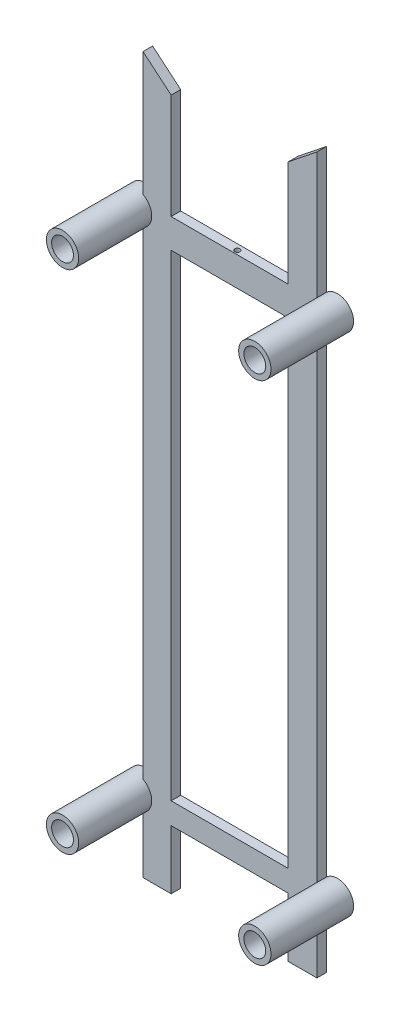
ISO-10303-21;
HEADER;
FILE_DESCRIPTION(('STEP AP214'),'2;1');
FILE_NAME('part.step','',(''),(''),'','','');
FILE_SCHEMA(('AUTOMOTIVE_DESIGN { 1 0 10303 214 1 1 1 1 }'));
ENDSEC;
DATA;
#1=APPLICATION_CONTEXT('core data for automotive mechanical design processes');
#2=APPLICATION_PROTOCOL_DEFINITION('international standard','automotive_design',2000,#1);
#3=PRODUCT_CONTEXT('',#1,'mechanical');
#4=PRODUCT('Part','Part','',(#3));
#5=PRODUCT_RELATED_PRODUCT_CATEGORY('part','',(#4));
#6=PRODUCT_DEFINITION_FORMATION('','',#4);
#7=PRODUCT_DEFINITION_CONTEXT('part definition',#1,'design');
#8=PRODUCT_DEFINITION('design','',#6,#7);
#9=PRODUCT_DEFINITION_SHAPE('','',#8);
#10=(LENGTH_UNIT() NAMED_UNIT(*) SI_UNIT(.MILLI.,.METRE.));
#11=(NAMED_UNIT(*) PLANE_ANGLE_UNIT() SI_UNIT($,.RADIAN.));
#12=(NAMED_UNIT(*) SI_UNIT($,.STERADIAN.) SOLID_ANGLE_UNIT());
#13=UNCERTAINTY_MEASURE_WITH_UNIT(LENGTH_MEASURE(1.E-05),#10,'distance_accuracy_value','');
#14=(GEOMETRIC_REPRESENTATION_CONTEXT(3) GLOBAL_UNCERTAINTY_ASSIGNED_CONTEXT((#13)) GLOBAL_UNIT_ASSIGNED_CONTEXT((#10,
#11,#12)) REPRESENTATION_CONTEXT('',''));
#15=CARTESIAN_POINT('',(0.,0.,0.));
#16=DIRECTION('',(0.,0.,1.));
#17=DIRECTION('',(1.,0.,0.));
#18=AXIS2_PLACEMENT_3D('',#15,#16,#17);
#19=CARTESIAN_POINT('',(518.159541103016,0.,1061.01410856187));
#20=DIRECTION('',(-1.,0.,0.));
#21=DIRECTION('',(0.,0.,1.));
#22=AXIS2_PLACEMENT_3D('',#19,#20,#21);
#23=PLANE('',#22);
#24=DIRECTION('',(0.,1.,0.));
#25=VECTOR('',#24,1.);
#26=CARTESIAN_POINT('',(518.159541103016,0.,1027.01410856187));
#27=LINE('',#26,#25);
#28=CARTESIAN_POINT('',(518.159541103016,-2062.02336684521,1027.01410856187));
#29=VERTEX_POINT('',#28);
#30=CARTESIAN_POINT('',(518.159541103016,-368.039095782691,1027.01410856187));
#31=VERTEX_POINT('',#30);
#32=EDGE_CURVE('E543',#29,#31,#27,.T.);
#33=ORIENTED_EDGE('',*,*,#32,.F.);
#34=DIRECTION('',(0.,0.,-1.));
#35=VECTOR('',#34,1.);
#36=CARTESIAN_POINT('',(518.159541103016,-2062.02336684521,1320.01410856187));
#37=LINE('',#36,#35);
#38=CARTESIAN_POINT('',(518.159541103016,-2062.02336684521,1061.01410856187));
#39=VERTEX_POINT('',#38);
#40=EDGE_CURVE('E415',#29,#39,#37,.F.);
#41=ORIENTED_EDGE('',*,*,#40,.T.);
#42=DIRECTION('',(0.,1.,0.));
#43=VECTOR('',#42,1.);
#44=CARTESIAN_POINT('',(518.159541103016,0.,1061.01410856187));
#45=LINE('',#44,#43);
#46=CARTESIAN_POINT('',(518.159541103016,-368.039095782691,1061.01410856187));
#47=VERTEX_POINT('',#46);
#48=EDGE_CURVE('E368',#39,#47,#45,.T.);
#49=ORIENTED_EDGE('',*,*,#48,.T.);
#50=DIRECTION('',(0.,0.,-1.));
#51=VECTOR('',#50,1.);
#52=CARTESIAN_POINT('',(518.159541103016,-368.039095782691,1320.01410856187));
#53=LINE('',#52,#51);
#54=EDGE_CURVE('E399',#47,#31,#53,.T.);
#55=ORIENTED_EDGE('',*,*,#54,.T.);
#56=EDGE_LOOP('',(#33,#41,#49,#55));
#57=FACE_BOUND('',#56,.T.);
#58=ADVANCED_FACE('F91',(#57),#23,.T.);
#59=CARTESIAN_POINT('',(518.159541103016,-2363.99744422089,1061.01410856187));
#60=VERTEX_POINT('',#59);
#61=CARTESIAN_POINT('',(518.159541103016,-2163.69833162458,1061.01410856187));
#62=VERTEX_POINT('',#61);
#63=EDGE_CURVE('E367',#60,#62,#45,.T.);
#64=ORIENTED_EDGE('',*,*,#63,.T.);
#65=DIRECTION('',(0.,0.,-1.));
#66=VECTOR('',#65,1.);
#67=CARTESIAN_POINT('',(518.159541103016,-2163.69833162458,1320.01410856187));
#68=LINE('',#67,#66);
#69=CARTESIAN_POINT('',(518.159541103016,-2163.69833162458,1027.01410856187));
#70=VERTEX_POINT('',#69);
#71=EDGE_CURVE('E420',#62,#70,#68,.T.);
#72=ORIENTED_EDGE('',*,*,#71,.T.);
#73=CARTESIAN_POINT('',(518.159541103016,-2363.99744422089,1027.01410856187));
#74=VERTEX_POINT('',#73);
#75=EDGE_CURVE('E538',#74,#70,#27,.T.);
#76=ORIENTED_EDGE('',*,*,#75,.F.);
#77=DIRECTION('',(0.,0.,-1.));
#78=VECTOR('',#77,1.);
#79=CARTESIAN_POINT('',(518.159541103016,-2363.99744422089,1061.01410856187));
#80=LINE('',#79,#78);
#81=EDGE_CURVE('E338',#60,#74,#80,.T.);
#82=ORIENTED_EDGE('',*,*,#81,.F.);
#83=EDGE_LOOP('',(#64,#72,#76,#82));
#84=FACE_BOUND('',#83,.T.);
#85=ADVANCED_FACE('F540',(#84),#23,.T.);
#86=CARTESIAN_POINT('',(0.,0.,1061.01410856187));
#87=DIRECTION('',(0.,0.,-1.));
#88=DIRECTION('',(-1.,0.,0.));
#89=AXIS2_PLACEMENT_3D('',#86,#87,#88);
#90=PLANE('',#89);
#91=CARTESIAN_POINT('',(518.159541103016,-2141.26120570312,1061.01410856187));
#92=VERTEX_POINT('',#91);
#93=CARTESIAN_POINT('',(518.159541103016,-2084.46049276666,1061.01410856187));
#94=VERTEX_POINT('',#93);
#95=EDGE_CURVE('E360',#92,#94,#45,.T.);
#96=ORIENTED_EDGE('',*,*,#95,.F.);
#97=CARTESIAN_POINT('',(491.765116757733,-2112.86084923489,1061.01410856187));
#98=DIRECTION('',(0.,0.,-1.));
#99=DIRECTION('',(-1.,0.,0.));
#100=AXIS2_PLACEMENT_3D('',#97,#98,#99);
#101=CIRCLE('',#100,38.771715);
#102=EDGE_CURVE('E99',#92,#94,#101,.F.);
#103=ORIENTED_EDGE('',*,*,#102,.T.);
#104=EDGE_LOOP('',(#96,#103));
#105=FACE_BOUND('',#104,.T.);
#106=ADVANCED_FACE('F359',(#105),#90,.F.);
#107=CARTESIAN_POINT('',(518.159541103016,-266.364131003321,1027.01410856187));
#108=VERTEX_POINT('',#107);
#109=CARTESIAN_POINT('',(518.159541103016,172.765208514383,1027.01410856187));
#110=VERTEX_POINT('',#109);
#111=EDGE_CURVE('E546',#108,#110,#27,.T.);
#112=ORIENTED_EDGE('',*,*,#111,.F.);
#113=DIRECTION('',(0.,0.,-1.));
#114=VECTOR('',#113,1.);
#115=CARTESIAN_POINT('',(518.159541103016,-266.364131003321,1320.01410856187));
#116=LINE('',#115,#114);
#117=CARTESIAN_POINT('',(518.159541103016,-266.364131003321,1061.01410856187));
#118=VERTEX_POINT('',#117);
#119=EDGE_CURVE('E396',#108,#118,#116,.F.);
#120=ORIENTED_EDGE('',*,*,#119,.T.);
#121=CARTESIAN_POINT('',(518.159541103016,172.765208514383,1061.01410856187));
#122=VERTEX_POINT('',#121);
#123=EDGE_CURVE('E370',#118,#122,#45,.T.);
#124=ORIENTED_EDGE('',*,*,#123,.T.);
#125=DIRECTION('',(0.,0.,-1.));
#126=VECTOR('',#125,1.);
#127=CARTESIAN_POINT('',(518.159541103016,172.765208514383,1061.01410856187));
#128=LINE('',#127,#126);
#129=EDGE_CURVE('E321',#122,#110,#128,.T.);
#130=ORIENTED_EDGE('',*,*,#129,.T.);
#131=EDGE_LOOP('',(#112,#120,#124,#130));
#132=FACE_BOUND('',#131,.T.);
#133=ADVANCED_FACE('F614',(#132),#23,.T.);
#134=DIRECTION('',(0.,0.,-1.));
#135=VECTOR('',#134,1.);
#136=CARTESIAN_POINT('',(518.159541103016,-2084.46049276666,1320.01410856187));
#137=LINE('',#136,#135);
#138=CARTESIAN_POINT('',(518.159541103016,-2084.46049276666,1027.01410856187));
#139=VERTEX_POINT('',#138);
#140=EDGE_CURVE('E106',#139,#94,#137,.F.);
#141=ORIENTED_EDGE('',*,*,#140,.F.);
#142=CARTESIAN_POINT('',(518.159541103016,-2141.26120570312,1027.01410856187));
#143=VERTEX_POINT('',#142);
#144=EDGE_CURVE('E541',#143,#139,#27,.T.);
#145=ORIENTED_EDGE('',*,*,#144,.F.);
#146=DIRECTION('',(0.,0.,-1.));
#147=VECTOR('',#146,1.);
#148=CARTESIAN_POINT('',(518.159541103016,-2141.26120570312,1320.01410856187));
#149=LINE('',#148,#147);
#150=EDGE_CURVE('E366',#92,#143,#149,.T.);
#151=ORIENTED_EDGE('',*,*,#150,.F.);
#152=ORIENTED_EDGE('',*,*,#95,.T.);
#153=EDGE_LOOP('',(#141,#145,#151,#152));
#154=FACE_BOUND('',#153,.T.);
#155=ADVANCED_FACE('F363',(#154),#23,.T.);
#156=CARTESIAN_POINT('',(518.159541103016,-345.601969861233,1061.01410856187));
#157=VERTEX_POINT('',#156);
#158=CARTESIAN_POINT('',(518.159541103016,-288.801256924779,1061.01410856187));
#159=VERTEX_POINT('',#158);
#160=EDGE_CURVE('E373',#157,#159,#45,.T.);
#161=ORIENTED_EDGE('',*,*,#160,.F.);
#162=CARTESIAN_POINT('',(491.765116757733,-317.201613393006,1061.01410856187));
#163=DIRECTION('',(0.,0.,-1.));
#164=DIRECTION('',(-1.,0.,0.));
#165=AXIS2_PLACEMENT_3D('',#162,#163,#164);
#166=CIRCLE('',#165,38.771715);
#167=EDGE_CURVE('E352',#157,#159,#166,.F.);
#168=ORIENTED_EDGE('',*,*,#167,.T.);
#169=EDGE_LOOP('',(#161,#168));
#170=FACE_BOUND('',#169,.T.);
#171=ADVANCED_FACE('F627',(#170),#90,.F.);
#172=CARTESIAN_POINT('',(1173.63922552686,-317.201613393006,1320.01410856187));
#173=DIRECTION('',(0.,0.,-1.));
#174=DIRECTION('',(-1.,0.,0.));
#175=AXIS2_PLACEMENT_3D('',#172,#173,#174);
#176=CYLINDRICAL_SURFACE('',#175,57.2810174636805);
#177=CARTESIAN_POINT('',(1173.63922552686,-317.201613393006,1320.01410856187));
#178=DIRECTION('',(0.,0.,1.));
#179=DIRECTION('',(1.,0.,0.));
#180=AXIS2_PLACEMENT_3D('',#177,#178,#179);
#181=CIRCLE('',#180,57.2810174636805);
#182=CARTESIAN_POINT('',(1230.92024299054,-317.201613393006,1320.01410856187));
#183=VERTEX_POINT('',#182);
#184=EDGE_CURVE('E349',#183,#183,#181,.T.);
#185=ORIENTED_EDGE('',*,*,#184,.F.);
#186=EDGE_LOOP('',(#185));
#187=FACE_BOUND('',#186,.T.);
#188=DIRECTION('',(0.,0.,-1.));
#189=VECTOR('',#188,1.);
#190=CARTESIAN_POINT('',(1134.86751024174,-275.036828850402,1320.01410856187));
#191=LINE('',#190,#189);
#192=CARTESIAN_POINT('',(1134.86751024174,-275.036828850402,1061.01410856187));
#193=VERTEX_POINT('',#192);
#194=CARTESIAN_POINT('',(1134.86751024174,-275.036828850402,1027.01410856187));
#195=VERTEX_POINT('',#194);
#196=EDGE_CURVE('E340',#193,#195,#191,.T.);
#197=ORIENTED_EDGE('',*,*,#196,.F.);
#198=CARTESIAN_POINT('',(1173.63922552686,-317.201613393006,1061.01410856187));
#199=DIRECTION('',(0.,0.,-1.));
#200=DIRECTION('',(-1.,0.,0.));
#201=AXIS2_PLACEMENT_3D('',#198,#199,#200);
#202=CIRCLE('',#201,57.2810174636805);
#203=CARTESIAN_POINT('',(1134.86751024174,-359.36639793561,1061.01410856187));
#204=VERTEX_POINT('',#203);
#205=EDGE_CURVE('E334',#204,#193,#202,.T.);
#206=ORIENTED_EDGE('',*,*,#205,.F.);
#207=DIRECTION('',(0.,0.,-1.));
#208=VECTOR('',#207,1.);
#209=CARTESIAN_POINT('',(1134.86751024174,-359.36639793561,1320.01410856187));
#210=LINE('',#209,#208);
#211=CARTESIAN_POINT('',(1134.86751024174,-359.36639793561,1027.01410856187));
#212=VERTEX_POINT('',#211);
#213=EDGE_CURVE('E337',#212,#204,#210,.F.);
#214=ORIENTED_EDGE('',*,*,#213,.F.);
#215=CARTESIAN_POINT('',(1173.63922552686,-317.201613393006,1027.01410856187));
#216=DIRECTION('',(0.,0.,1.));
#217=DIRECTION('',(1.,0.,0.));
#218=AXIS2_PLACEMENT_3D('',#215,#216,#217);
#219=CIRCLE('',#218,57.2810174636805);
#220=EDGE_CURVE('E295',#212,#195,#219,.T.);
#221=ORIENTED_EDGE('',*,*,#220,.T.);
#222=EDGE_LOOP('',(#197,#206,#214,#221));
#223=FACE_BOUND('',#222,.T.);
#224=ADVANCED_FACE('F93',(#187,#223),#176,.T.);
#225=CARTESIAN_POINT('',(1173.63922552686,-317.201613393006,1320.01410856187));
#226=DIRECTION('',(0.,0.,1.));
#227=DIRECTION('',(1.,0.,0.));
#228=AXIS2_PLACEMENT_3D('',#225,#226,#227);
#229=PLANE('',#228);
#230=ORIENTED_EDGE('',*,*,#184,.T.);
#231=EDGE_LOOP('',(#230));
#232=FACE_BOUND('',#231,.T.);
#233=CARTESIAN_POINT('',(1173.63922552686,-317.201613393006,1320.01410856187));
#234=DIRECTION('',(0.,0.,1.));
#235=DIRECTION('',(1.,0.,0.));
#236=AXIS2_PLACEMENT_3D('',#233,#234,#235);
#237=CIRCLE('',#236,38.7717152851179);
#238=CARTESIAN_POINT('',(1212.41094081198,-317.201613393006,1320.01410856187));
#239=VERTEX_POINT('',#238);
#240=EDGE_CURVE('E344',#239,#239,#237,.T.);
#241=ORIENTED_EDGE('',*,*,#240,.F.);
#242=EDGE_LOOP('',(#241));
#243=FACE_BOUND('',#242,.T.);
#244=ADVANCED_FACE('F703',(#232,#243),#229,.T.);
#245=CARTESIAN_POINT('',(1173.63922552686,-317.201613393006,1027.01410856187));
#246=DIRECTION('',(0.,0.,1.));
#247=DIRECTION('',(1.,0.,0.));
#248=AXIS2_PLACEMENT_3D('',#245,#246,#247);
#249=PLANE('',#248);
#250=CARTESIAN_POINT('',(491.765116757733,-2112.86084923489,1027.01410856187));
#251=DIRECTION('',(0.,0.,1.));
#252=DIRECTION('',(1.,0.,0.));
#253=AXIS2_PLACEMENT_3D('',#250,#251,#252);
#254=CIRCLE('',#253,38.771715);
#255=EDGE_CURVE('E431',#139,#143,#254,.T.);
#256=ORIENTED_EDGE('',*,*,#255,.T.);
#257=ORIENTED_EDGE('',*,*,#144,.T.);
#258=EDGE_LOOP('',(#256,#257));
#259=FACE_BOUND('',#258,.T.);
#260=ORIENTED_EDGE('',*,*,#75,.T.);
#261=CARTESIAN_POINT('',(491.765116757733,-2112.86084923489,1027.01410856187));
#262=DIRECTION('',(0.,0.,1.));
#263=DIRECTION('',(1.,0.,0.));
#264=AXIS2_PLACEMENT_3D('',#261,#262,#263);
#265=CIRCLE('',#264,57.2810200000001);
#266=EDGE_CURVE('E426',#29,#70,#265,.T.);
#267=ORIENTED_EDGE('',*,*,#266,.F.);
#268=ORIENTED_EDGE('',*,*,#32,.T.);
#269=CARTESIAN_POINT('',(491.765116757733,-317.201613393006,1027.01410856187));
#270=DIRECTION('',(0.,0.,1.));
#271=DIRECTION('',(1.,0.,0.));
#272=AXIS2_PLACEMENT_3D('',#269,#270,#271);
#273=CIRCLE('',#272,57.28102);
#274=EDGE_CURVE('E406',#108,#31,#273,.T.);
#275=ORIENTED_EDGE('',*,*,#274,.F.);
#276=ORIENTED_EDGE('',*,*,#111,.T.);
#277=DIRECTION('',(0.765360515626495,-0.643601803229253,0.));
#278=VECTOR('',#277,1.);
#279=CARTESIAN_POINT('',(299.735711510121,356.440702251024,1027.01410856187));
#280=LINE('',#279,#278);
#281=CARTESIAN_POINT('',(617.883714932091,88.9058287952673,1027.01410856187));
#282=VERTEX_POINT('',#281);
#283=EDGE_CURVE('E474',#110,#282,#280,.T.);
#284=ORIENTED_EDGE('',*,*,#283,.T.);
#285=DIRECTION('',(0.,1.,0.));
#286=VECTOR('',#285,1.);
#287=CARTESIAN_POINT('',(617.883714932091,0.,1027.01410856187));
#288=LINE('',#287,#286);
#289=CARTESIAN_POINT('',(617.883714932091,-284.095196719198,1027.01410856187));
#290=VERTEX_POINT('',#289);
#291=EDGE_CURVE('E469',#290,#282,#288,.T.);
#292=ORIENTED_EDGE('',*,*,#291,.F.);
#293=DIRECTION('',(-1.,0.,0.));
#294=VECTOR('',#293,1.);
#295=CARTESIAN_POINT('',(0.,-284.095196719198,1027.01410856187));
#296=LINE('',#295,#294);
#297=CARTESIAN_POINT('',(1033.16669392661,-284.095196719198,1027.01410856187));
#298=VERTEX_POINT('',#297);
#299=EDGE_CURVE('E462',#298,#290,#296,.T.);
#300=ORIENTED_EDGE('',*,*,#299,.F.);
#301=DIRECTION('',(0.,1.,0.));
#302=VECTOR('',#301,1.);
#303=CARTESIAN_POINT('',(1033.16669392661,0.,1027.01410856187));
#304=LINE('',#303,#302);
#305=CARTESIAN_POINT('',(1033.16669392661,91.6171502164165,1027.01410856187));
#306=VERTEX_POINT('',#305);
#307=EDGE_CURVE('E468',#298,#306,#304,.T.);
#308=ORIENTED_EDGE('',*,*,#307,.T.);
#309=DIRECTION('',(-0.781665241211568,-0.623698204808754,0.));
#310=VECTOR('',#309,1.);
#311=CARTESIAN_POINT('',(357.235789445738,-447.714611607919,1027.01410856187));
#312=LINE('',#311,#310);
#313=CARTESIAN_POINT('',(1134.86751024174,172.765208514383,1027.01410856187));
#314=VERTEX_POINT('',#313);
#315=EDGE_CURVE('E471',#314,#306,#312,.T.);
#316=ORIENTED_EDGE('',*,*,#315,.F.);
#317=DIRECTION('',(0.,1.,0.));
#318=VECTOR('',#317,1.);
#319=CARTESIAN_POINT('',(1134.86751024174,0.,1027.01410856187));
#320=LINE('',#319,#318);
#321=EDGE_CURVE('E299',#195,#314,#320,.T.);
#322=ORIENTED_EDGE('',*,*,#321,.F.);
#323=ORIENTED_EDGE('',*,*,#220,.F.);
#324=CARTESIAN_POINT('',(1134.86751024174,-2070.69606124669,1027.01410856187));
#325=VERTEX_POINT('',#324);
#326=EDGE_CURVE('E290',#325,#212,#320,.T.);
#327=ORIENTED_EDGE('',*,*,#326,.F.);
#328=CARTESIAN_POINT('',(1173.63922552686,-2112.86084923489,1027.01410856187));
#329=DIRECTION('',(0.,0.,1.));
#330=DIRECTION('',(1.,0.,0.));
#331=AXIS2_PLACEMENT_3D('',#328,#329,#330);
#332=CIRCLE('',#331,57.2810200000001);
#333=CARTESIAN_POINT('',(1134.86751024174,-2155.02563722309,1027.01410856187));
#334=VERTEX_POINT('',#333);
#335=EDGE_CURVE('E274',#334,#325,#332,.T.);
#336=ORIENTED_EDGE('',*,*,#335,.F.);
#337=DIRECTION('',(0.,1.,0.));
#338=VECTOR('',#337,1.);
#339=CARTESIAN_POINT('',(1134.86751024174,0.,1027.01410856187));
#340=LINE('',#339,#338);
#341=CARTESIAN_POINT('',(1134.86751024174,-2363.99744422089,1027.01410856187));
#342=VERTEX_POINT('',#341);
#343=EDGE_CURVE('E298',#342,#334,#340,.T.);
#344=ORIENTED_EDGE('',*,*,#343,.F.);
#345=DIRECTION('',(-1.,0.,0.));
#346=VECTOR('',#345,1.);
#347=CARTESIAN_POINT('',(0.,-2363.99744422089,1027.01410856187));
#348=LINE('',#347,#346);
#349=CARTESIAN_POINT('',(1033.16669392661,-2363.99744422089,1027.01410856187));
#350=VERTEX_POINT('',#349);
#351=EDGE_CURVE('E481',#342,#350,#348,.T.);
#352=ORIENTED_EDGE('',*,*,#351,.T.);
#353=DIRECTION('',(0.,1.,0.));
#354=VECTOR('',#353,1.);
#355=CARTESIAN_POINT('',(1033.16669392661,0.,1027.01410856187));
#356=LINE('',#355,#354);
#357=CARTESIAN_POINT('',(1033.16669392661,-2154.50626286869,1027.01410856187));
#358=VERTEX_POINT('',#357);
#359=EDGE_CURVE('E484',#350,#358,#356,.T.);
#360=ORIENTED_EDGE('',*,*,#359,.T.);
#361=DIRECTION('',(-1.,0.,0.));
#362=VECTOR('',#361,1.);
#363=CARTESIAN_POINT('',(0.,-2154.50626286869,1027.01410856187));
#364=LINE('',#363,#362);
#365=CARTESIAN_POINT('',(617.883714932091,-2154.50626286869,1027.01410856187));
#366=VERTEX_POINT('',#365);
#367=EDGE_CURVE('E487',#358,#366,#364,.T.);
#368=ORIENTED_EDGE('',*,*,#367,.T.);
#369=DIRECTION('',(0.,1.,0.));
#370=VECTOR('',#369,1.);
#371=CARTESIAN_POINT('',(617.883714932091,0.,1027.01410856187));
#372=LINE('',#371,#370);
#373=CARTESIAN_POINT('',(617.883714932091,-2363.99744422089,1027.01410856187));
#374=VERTEX_POINT('',#373);
#375=EDGE_CURVE('E490',#374,#366,#372,.T.);
#376=ORIENTED_EDGE('',*,*,#375,.F.);
#377=DIRECTION('',(1.,0.,0.));
#378=VECTOR('',#377,1.);
#379=CARTESIAN_POINT('',(0.,-2363.99744422089,1027.01410856187));
#380=LINE('',#379,#378);
#381=EDGE_CURVE('E395',#74,#374,#380,.T.);
#382=ORIENTED_EDGE('',*,*,#381,.F.);
#383=EDGE_LOOP('',(#260,#267,#268,#275,#276,#284,#292,#300,#308,#316,#322,#323,#327,#336,#344,
#352,#360,#368,#376,#382));
#384=FACE_BOUND('',#383,.T.);
#385=CARTESIAN_POINT('',(1173.63922552686,-317.201613393006,1027.01410856187));
#386=DIRECTION('',(0.,0.,1.));
#387=DIRECTION('',(1.,0.,0.));
#388=AXIS2_PLACEMENT_3D('',#385,#386,#387);
#389=CIRCLE('',#388,38.7717152851179);
#390=CARTESIAN_POINT('',(1212.41094081198,-317.201613393006,1027.01410856187));
#391=VERTEX_POINT('',#390);
#392=EDGE_CURVE('E343',#391,#391,#389,.T.);
#393=ORIENTED_EDGE('',*,*,#392,.T.);
#394=EDGE_LOOP('',(#393));
#395=FACE_BOUND('',#394,.T.);
#396=DIRECTION('',(0.,1.,0.));
#397=VECTOR('',#396,1.);
#398=CARTESIAN_POINT('',(1033.16669392661,0.,1027.01410856187));
#399=LINE('',#398,#397);
#400=CARTESIAN_POINT('',(1033.16669392661,-2078.31095892184,1027.01410856187));
#401=VERTEX_POINT('',#400);
#402=CARTESIAN_POINT('',(1033.16669392661,-387.582459759298,1027.01410856187));
#403=VERTEX_POINT('',#402);
#404=EDGE_CURVE('E558',#401,#403,#399,.T.);
#405=ORIENTED_EDGE('',*,*,#404,.T.);
#406=DIRECTION('',(-1.,0.,0.));
#407=VECTOR('',#406,1.);
#408=CARTESIAN_POINT('',(0.,-387.582459759298,1027.01410856187));
#409=LINE('',#408,#407);
#410=CARTESIAN_POINT('',(617.883714932091,-387.582459759298,1027.01410856187));
#411=VERTEX_POINT('',#410);
#412=EDGE_CURVE('E555',#403,#411,#409,.T.);
#413=ORIENTED_EDGE('',*,*,#412,.T.);
#414=DIRECTION('',(0.,1.,0.));
#415=VECTOR('',#414,1.);
#416=CARTESIAN_POINT('',(617.883714932091,0.,1027.01410856187));
#417=LINE('',#416,#415);
#418=CARTESIAN_POINT('',(617.883714932091,-2078.31095892184,1027.01410856187));
#419=VERTEX_POINT('',#418);
#420=EDGE_CURVE('E551',#419,#411,#417,.T.);
#421=ORIENTED_EDGE('',*,*,#420,.F.);
#422=DIRECTION('',(-1.,0.,0.));
#423=VECTOR('',#422,1.);
#424=CARTESIAN_POINT('',(0.,-2078.31095892184,1027.01410856187));
#425=LINE('',#424,#423);
#426=EDGE_CURVE('E398',#401,#419,#425,.T.);
#427=ORIENTED_EDGE('',*,*,#426,.F.);
#428=EDGE_LOOP('',(#405,#413,#421,#427));
#429=FACE_BOUND('',#428,.T.);
#430=CARTESIAN_POINT('',(518.159541103016,-345.601969861233,1027.01410856187));
#431=VERTEX_POINT('',#430);
#432=CARTESIAN_POINT('',(518.159541103016,-288.801256924779,1027.01410856187));
#433=VERTEX_POINT('',#432);
#434=EDGE_CURVE('E544',#431,#433,#27,.T.);
#435=ORIENTED_EDGE('',*,*,#434,.T.);
#436=CARTESIAN_POINT('',(491.765116757733,-317.201613393006,1027.01410856187));
#437=DIRECTION('',(0.,0.,1.));
#438=DIRECTION('',(1.,0.,0.));
#439=AXIS2_PLACEMENT_3D('',#436,#437,#438);
#440=CIRCLE('',#439,38.771715);
#441=EDGE_CURVE('E412',#433,#431,#440,.T.);
#442=ORIENTED_EDGE('',*,*,#441,.T.);
#443=EDGE_LOOP('',(#435,#442));
#444=FACE_BOUND('',#443,.T.);
#445=CARTESIAN_POINT('',(1173.63922552686,-2112.86084923489,1027.01410856187));
#446=DIRECTION('',(0.,0.,1.));
#447=DIRECTION('',(1.,0.,0.));
#448=AXIS2_PLACEMENT_3D('',#445,#446,#447);
#449=CIRCLE('',#448,38.7717149999999);
#450=CARTESIAN_POINT('',(1212.41094052686,-2112.86084923489,1027.01410856187));
#451=VERTEX_POINT('',#450);
#452=EDGE_CURVE('E438',#451,#451,#449,.T.);
#453=ORIENTED_EDGE('',*,*,#452,.T.);
#454=EDGE_LOOP('',(#453));
#455=FACE_BOUND('',#454,.T.);
#456=ADVANCED_FACE('F292',(#259,#384,#395,#429,#444,#455),#249,.F.);
#457=CARTESIAN_POINT('',(1173.63922552686,-317.201613393006,1320.01410856187));
#458=DIRECTION('',(0.,0.,-1.));
#459=DIRECTION('',(-1.,0.,0.));
#460=AXIS2_PLACEMENT_3D('',#457,#458,#459);
#461=CYLINDRICAL_SURFACE('',#460,38.7717152851179);
#462=ORIENTED_EDGE('',*,*,#392,.F.);
#463=EDGE_LOOP('',(#462));
#464=FACE_BOUND('',#463,.T.);
#465=ORIENTED_EDGE('',*,*,#240,.T.);
#466=EDGE_LOOP('',(#465));
#467=FACE_BOUND('',#466,.T.);
#468=ADVANCED_FACE('F689',(#464,#467),#461,.F.);
#469=CARTESIAN_POINT('',(1134.86751024174,0.,1061.01410856187));
#470=DIRECTION('',(-1.,0.,0.));
#471=DIRECTION('',(0.,0.,1.));
#472=AXIS2_PLACEMENT_3D('',#469,#470,#471);
#473=PLANE('',#472);
#474=DIRECTION('',(0.,1.,0.));
#475=VECTOR('',#474,1.);
#476=CARTESIAN_POINT('',(1134.86751024174,0.,1061.01410856187));
#477=LINE('',#476,#475);
#478=CARTESIAN_POINT('',(1134.86751024174,172.765208514383,1061.01410856187));
#479=VERTEX_POINT('',#478);
#480=EDGE_CURVE('E575',#193,#479,#477,.T.);
#481=ORIENTED_EDGE('',*,*,#480,.F.);
#482=ORIENTED_EDGE('',*,*,#196,.T.);
#483=ORIENTED_EDGE('',*,*,#321,.T.);
#484=DIRECTION('',(0.,0.,-1.));
#485=VECTOR('',#484,1.);
#486=CARTESIAN_POINT('',(1134.86751024174,172.765208514383,1061.01410856187));
#487=LINE('',#486,#485);
#488=EDGE_CURVE('E305',#479,#314,#487,.T.);
#489=ORIENTED_EDGE('',*,*,#488,.F.);
#490=EDGE_LOOP('',(#481,#482,#483,#489));
#491=FACE_BOUND('',#490,.T.);
#492=ADVANCED_FACE('F687',(#491),#473,.F.);
#493=ORIENTED_EDGE('',*,*,#326,.T.);
#494=ORIENTED_EDGE('',*,*,#213,.T.);
#495=CARTESIAN_POINT('',(1134.86751024174,-2070.69606124669,1061.01410856187));
#496=VERTEX_POINT('',#495);
#497=EDGE_CURVE('E303',#496,#204,#477,.T.);
#498=ORIENTED_EDGE('',*,*,#497,.F.);
#499=DIRECTION('',(0.,0.,-1.));
#500=VECTOR('',#499,1.);
#501=CARTESIAN_POINT('',(1134.86751024174,-2070.69606124669,1061.01410856187));
#502=LINE('',#501,#500);
#503=EDGE_CURVE('E278',#496,#325,#502,.T.);
#504=ORIENTED_EDGE('',*,*,#503,.T.);
#505=EDGE_LOOP('',(#493,#494,#498,#504));
#506=FACE_BOUND('',#505,.T.);
#507=ADVANCED_FACE('F301',(#506),#473,.F.);
#508=CARTESIAN_POINT('',(0.,-387.582459759298,1061.01410856187));
#509=DIRECTION('',(0.,-1.,0.));
#510=DIRECTION('',(0.,0.,-1.));
#511=AXIS2_PLACEMENT_3D('',#508,#509,#510);
#512=PLANE('',#511);
#513=CARTESIAN_POINT('',(838.898443773794,-387.582459759298,1047.15515701302));
#514=DIRECTION('',(0.,-1.,0.));
#515=DIRECTION('',(0.,0.,-1.));
#516=AXIS2_PLACEMENT_3D('',#513,#514,#515);
#517=CIRCLE('',#516,9.31366205789842);
#518=CARTESIAN_POINT('',(838.898443773794,-387.582459759298,1037.84149495512));
#519=VERTEX_POINT('',#518);
#520=EDGE_CURVE('E441',#519,#519,#517,.T.);
#521=ORIENTED_EDGE('',*,*,#520,.F.);
#522=EDGE_LOOP('',(#521));
#523=FACE_BOUND('',#522,.T.);
#524=ORIENTED_EDGE('',*,*,#412,.F.);
#525=DIRECTION('',(0.,0.,-1.));
#526=VECTOR('',#525,1.);
#527=CARTESIAN_POINT('',(1033.16669392661,-387.582459759298,1061.01410856187));
#528=LINE('',#527,#526);
#529=CARTESIAN_POINT('',(1033.16669392661,-387.582459759298,1061.01410856187));
#530=VERTEX_POINT('',#529);
#531=EDGE_CURVE('E329',#530,#403,#528,.T.);
#532=ORIENTED_EDGE('',*,*,#531,.F.);
#533=DIRECTION('',(-1.,0.,0.));
#534=VECTOR('',#533,1.);
#535=CARTESIAN_POINT('',(0.,-387.582459759298,1061.01410856187));
#536=LINE('',#535,#534);
#537=CARTESIAN_POINT('',(617.883714932091,-387.582459759298,1061.01410856187));
#538=VERTEX_POINT('',#537);
#539=EDGE_CURVE('E383',#530,#538,#536,.T.);
#540=ORIENTED_EDGE('',*,*,#539,.T.);
#541=DIRECTION('',(0.,0.,-1.));
#542=VECTOR('',#541,1.);
#543=CARTESIAN_POINT('',(617.883714932091,-387.582459759298,1061.01410856187));
#544=LINE('',#543,#542);
#545=EDGE_CURVE('E327',#538,#411,#544,.T.);
#546=ORIENTED_EDGE('',*,*,#545,.T.);
#547=EDGE_LOOP('',(#524,#532,#540,#546));
#548=FACE_BOUND('',#547,.T.);
#549=ADVANCED_FACE('F456',(#523,#548),#512,.T.);
#550=CARTESIAN_POINT('',(0.,-284.095196719198,1061.01410856187));
#551=DIRECTION('',(0.,-1.,0.));
#552=DIRECTION('',(0.,0.,-1.));
#553=AXIS2_PLACEMENT_3D('',#550,#551,#552);
#554=PLANE('',#553);
#555=CARTESIAN_POINT('',(838.898443773794,-284.095196719198,1047.15515701302));
#556=DIRECTION('',(0.,1.,0.));
#557=DIRECTION('',(0.,0.,1.));
#558=AXIS2_PLACEMENT_3D('',#555,#556,#557);
#559=CIRCLE('',#558,9.31366205789842);
#560=CARTESIAN_POINT('',(838.898443773794,-284.095196719198,1056.46881907091));
#561=VERTEX_POINT('',#560);
#562=EDGE_CURVE('E446',#561,#561,#559,.T.);
#563=ORIENTED_EDGE('',*,*,#562,.F.);
#564=EDGE_LOOP('',(#563));
#565=FACE_BOUND('',#564,.T.);
#566=ORIENTED_EDGE('',*,*,#299,.T.);
#567=DIRECTION('',(0.,0.,-1.));
#568=VECTOR('',#567,1.);
#569=CARTESIAN_POINT('',(617.883714932091,-284.095196719198,1061.01410856187));
#570=LINE('',#569,#568);
#571=CARTESIAN_POINT('',(617.883714932091,-284.095196719198,1061.01410856187));
#572=VERTEX_POINT('',#571);
#573=EDGE_CURVE('E317',#572,#290,#570,.T.);
#574=ORIENTED_EDGE('',*,*,#573,.F.);
#575=DIRECTION('',(-1.,0.,0.));
#576=VECTOR('',#575,1.);
#577=CARTESIAN_POINT('',(0.,-284.095196719198,1061.01410856187));
#578=LINE('',#577,#576);
#579=CARTESIAN_POINT('',(1033.16669392661,-284.095196719198,1061.01410856187));
#580=VERTEX_POINT('',#579);
#581=EDGE_CURVE('E581',#580,#572,#578,.T.);
#582=ORIENTED_EDGE('',*,*,#581,.F.);
#583=DIRECTION('',(0.,0.,-1.));
#584=VECTOR('',#583,1.);
#585=CARTESIAN_POINT('',(1033.16669392661,-284.095196719198,1061.01410856187));
#586=LINE('',#585,#584);
#587=EDGE_CURVE('E315',#580,#298,#586,.T.);
#588=ORIENTED_EDGE('',*,*,#587,.T.);
#589=EDGE_LOOP('',(#566,#574,#582,#588));
#590=FACE_BOUND('',#589,.T.);
#591=ADVANCED_FACE('F452',(#565,#590),#554,.F.);
#592=CARTESIAN_POINT('',(1033.16669392661,0.,1061.01410856187));
#593=DIRECTION('',(-1.,0.,0.));
#594=DIRECTION('',(0.,-1.,0.));
#595=AXIS2_PLACEMENT_3D('',#592,#593,#594);
#596=PLANE('',#595);
#597=ORIENTED_EDGE('',*,*,#404,.F.);
#598=DIRECTION('',(0.,0.,-1.));
#599=VECTOR('',#598,1.);
#600=CARTESIAN_POINT('',(1033.16669392661,-2078.31095892184,1061.01410856187));
#601=LINE('',#600,#599);
#602=CARTESIAN_POINT('',(1033.16669392661,-2078.31095892184,1061.01410856187));
#603=VERTEX_POINT('',#602);
#604=EDGE_CURVE('E331',#603,#401,#601,.T.);
#605=ORIENTED_EDGE('',*,*,#604,.F.);
#606=DIRECTION('',(0.,1.,0.));
#607=VECTOR('',#606,1.);
#608=CARTESIAN_POINT('',(1033.16669392661,0.,1061.01410856187));
#609=LINE('',#608,#607);
#610=EDGE_CURVE('E388',#603,#530,#609,.T.);
#611=ORIENTED_EDGE('',*,*,#610,.T.);
#612=ORIENTED_EDGE('',*,*,#531,.T.);
#613=EDGE_LOOP('',(#597,#605,#611,#612));
#614=FACE_BOUND('',#613,.T.);
#615=ADVANCED_FACE('F455',(#614),#596,.T.);
#616=CARTESIAN_POINT('',(0.,-2078.31095892184,1061.01410856187));
#617=DIRECTION('',(0.,-1.,0.));
#618=DIRECTION('',(0.,0.,-1.));
#619=AXIS2_PLACEMENT_3D('',#616,#617,#618);
#620=PLANE('',#619);
#621=ORIENTED_EDGE('',*,*,#426,.T.);
#622=DIRECTION('',(0.,0.,-1.));
#623=VECTOR('',#622,1.);
#624=CARTESIAN_POINT('',(617.883714932091,-2078.31095892184,1061.01410856187));
#625=LINE('',#624,#623);
#626=CARTESIAN_POINT('',(617.883714932091,-2078.31095892184,1061.01410856187));
#627=VERTEX_POINT('',#626);
#628=EDGE_CURVE('E324',#627,#419,#625,.T.);
#629=ORIENTED_EDGE('',*,*,#628,.F.);
#630=DIRECTION('',(-1.,0.,0.));
#631=VECTOR('',#630,1.);
#632=CARTESIAN_POINT('',(0.,-2078.31095892184,1061.01410856187));
#633=LINE('',#632,#631);
#634=EDGE_CURVE('E393',#603,#627,#633,.T.);
#635=ORIENTED_EDGE('',*,*,#634,.F.);
#636=ORIENTED_EDGE('',*,*,#604,.T.);
#637=EDGE_LOOP('',(#621,#629,#635,#636));
#638=FACE_BOUND('',#637,.T.);
#639=ADVANCED_FACE('F625',(#638),#620,.F.);
#640=CARTESIAN_POINT('',(617.883714932091,0.,1061.01410856187));
#641=DIRECTION('',(-1.,0.,0.));
#642=DIRECTION('',(0.,0.,1.));
#643=AXIS2_PLACEMENT_3D('',#640,#641,#642);
#644=PLANE('',#643);
#645=ORIENTED_EDGE('',*,*,#420,.T.);
#646=ORIENTED_EDGE('',*,*,#545,.F.);
#647=DIRECTION('',(0.,1.,0.));
#648=VECTOR('',#647,1.);
#649=CARTESIAN_POINT('',(617.883714932091,0.,1061.01410856187));
#650=LINE('',#649,#648);
#651=EDGE_CURVE('E376',#627,#538,#650,.T.);
#652=ORIENTED_EDGE('',*,*,#651,.F.);
#653=ORIENTED_EDGE('',*,*,#628,.T.);
#654=EDGE_LOOP('',(#645,#646,#652,#653));
#655=FACE_BOUND('',#654,.T.);
#656=ADVANCED_FACE('F618',(#655),#644,.F.);
#657=DIRECTION('',(0.,0.,-1.));
#658=VECTOR('',#657,1.);
#659=CARTESIAN_POINT('',(518.159541103016,-288.801256924779,1320.01410856187));
#660=LINE('',#659,#658);
#661=EDGE_CURVE('E114',#433,#159,#660,.F.);
#662=ORIENTED_EDGE('',*,*,#661,.F.);
#663=ORIENTED_EDGE('',*,*,#434,.F.);
#664=DIRECTION('',(0.,0.,-1.));
#665=VECTOR('',#664,1.);
#666=CARTESIAN_POINT('',(518.159541103016,-345.601969861233,1320.01410856187));
#667=LINE('',#666,#665);
#668=EDGE_CURVE('E403',#157,#431,#667,.T.);
#669=ORIENTED_EDGE('',*,*,#668,.F.);
#670=ORIENTED_EDGE('',*,*,#160,.T.);
#671=EDGE_LOOP('',(#662,#663,#669,#670));
#672=FACE_BOUND('',#671,.T.);
#673=ADVANCED_FACE('F610',(#672),#23,.T.);
#674=CARTESIAN_POINT('',(0.,-2363.99744422089,1061.01410856187));
#675=DIRECTION('',(0.,1.,0.));
#676=DIRECTION('',(0.,0.,1.));
#677=AXIS2_PLACEMENT_3D('',#674,#675,#676);
#678=PLANE('',#677);
#679=ORIENTED_EDGE('',*,*,#381,.T.);
#680=DIRECTION('',(0.,0.,-1.));
#681=VECTOR('',#680,1.);
#682=CARTESIAN_POINT('',(617.883714932091,-2363.99744422089,1061.01410856187));
#683=LINE('',#682,#681);
#684=CARTESIAN_POINT('',(617.883714932091,-2363.99744422089,1061.01410856187));
#685=VERTEX_POINT('',#684);
#686=EDGE_CURVE('E496',#685,#374,#683,.T.);
#687=ORIENTED_EDGE('',*,*,#686,.F.);
#688=DIRECTION('',(1.,0.,0.));
#689=VECTOR('',#688,1.);
#690=CARTESIAN_POINT('',(0.,-2363.99744422089,1061.01410856187));
#691=LINE('',#690,#689);
#692=EDGE_CURVE('E333',#60,#685,#691,.T.);
#693=ORIENTED_EDGE('',*,*,#692,.F.);
#694=ORIENTED_EDGE('',*,*,#81,.T.);
#695=EDGE_LOOP('',(#679,#687,#693,#694));
#696=FACE_BOUND('',#695,.T.);
#697=ADVANCED_FACE('F535',(#696),#678,.F.);
#698=CARTESIAN_POINT('',(617.883714932091,0.,1061.01410856187));
#699=DIRECTION('',(-1.,0.,0.));
#700=DIRECTION('',(0.,0.,1.));
#701=AXIS2_PLACEMENT_3D('',#698,#699,#700);
#702=PLANE('',#701);
#703=ORIENTED_EDGE('',*,*,#375,.T.);
#704=DIRECTION('',(0.,0.,-1.));
#705=VECTOR('',#704,1.);
#706=CARTESIAN_POINT('',(617.883714932091,-2154.50626286869,1061.01410856187));
#707=LINE('',#706,#705);
#708=CARTESIAN_POINT('',(617.883714932091,-2154.50626286869,1061.01410856187));
#709=VERTEX_POINT('',#708);
#710=EDGE_CURVE('E499',#709,#366,#707,.T.);
#711=ORIENTED_EDGE('',*,*,#710,.F.);
#712=DIRECTION('',(0.,1.,0.));
#713=VECTOR('',#712,1.);
#714=CARTESIAN_POINT('',(617.883714932091,0.,1061.01410856187));
#715=LINE('',#714,#713);
#716=EDGE_CURVE('E531',#685,#709,#715,.T.);
#717=ORIENTED_EDGE('',*,*,#716,.F.);
#718=ORIENTED_EDGE('',*,*,#686,.T.);
#719=EDGE_LOOP('',(#703,#711,#717,#718));
#720=FACE_BOUND('',#719,.T.);
#721=ADVANCED_FACE('F529',(#720),#702,.F.);
#722=CARTESIAN_POINT('',(0.,-2154.50626286869,1061.01410856187));
#723=DIRECTION('',(0.,-1.,0.));
#724=DIRECTION('',(0.,0.,-1.));
#725=AXIS2_PLACEMENT_3D('',#722,#723,#724);
#726=PLANE('',#725);
#727=ORIENTED_EDGE('',*,*,#367,.F.);
#728=DIRECTION('',(0.,0.,-1.));
#729=VECTOR('',#728,1.);
#730=CARTESIAN_POINT('',(1033.16669392661,-2154.50626286869,1061.01410856187));
#731=LINE('',#730,#729);
#732=CARTESIAN_POINT('',(1033.16669392661,-2154.50626286869,1061.01410856187));
#733=VERTEX_POINT('',#732);
#734=EDGE_CURVE('E501',#733,#358,#731,.T.);
#735=ORIENTED_EDGE('',*,*,#734,.F.);
#736=DIRECTION('',(-1.,0.,0.));
#737=VECTOR('',#736,1.);
#738=CARTESIAN_POINT('',(0.,-2154.50626286869,1061.01410856187));
#739=LINE('',#738,#737);
#740=EDGE_CURVE('E527',#733,#709,#739,.T.);
#741=ORIENTED_EDGE('',*,*,#740,.T.);
#742=ORIENTED_EDGE('',*,*,#710,.T.);
#743=EDGE_LOOP('',(#727,#735,#741,#742));
#744=FACE_BOUND('',#743,.T.);
#745=ADVANCED_FACE('F523',(#744),#726,.T.);
#746=CARTESIAN_POINT('',(1033.16669392661,0.,1061.01410856187));
#747=DIRECTION('',(-1.,0.,0.));
#748=DIRECTION('',(0.,-1.,0.));
#749=AXIS2_PLACEMENT_3D('',#746,#747,#748);
#750=PLANE('',#749);
#751=ORIENTED_EDGE('',*,*,#359,.F.);
#752=DIRECTION('',(0.,0.,-1.));
#753=VECTOR('',#752,1.);
#754=CARTESIAN_POINT('',(1033.16669392661,-2363.99744422089,1061.01410856187));
#755=LINE('',#754,#753);
#756=CARTESIAN_POINT('',(1033.16669392661,-2363.99744422089,1061.01410856187));
#757=VERTEX_POINT('',#756);
#758=EDGE_CURVE('E503',#757,#350,#755,.T.);
#759=ORIENTED_EDGE('',*,*,#758,.F.);
#760=DIRECTION('',(0.,1.,0.));
#761=VECTOR('',#760,1.);
#762=CARTESIAN_POINT('',(1033.16669392661,0.,1061.01410856187));
#763=LINE('',#762,#761);
#764=EDGE_CURVE('E568',#757,#733,#763,.T.);
#765=ORIENTED_EDGE('',*,*,#764,.T.);
#766=ORIENTED_EDGE('',*,*,#734,.T.);
#767=EDGE_LOOP('',(#751,#759,#765,#766));
#768=FACE_BOUND('',#767,.T.);
#769=ADVANCED_FACE('F519',(#768),#750,.T.);
#770=CARTESIAN_POINT('',(0.,-2363.99744422089,1061.01410856187));
#771=DIRECTION('',(0.,-1.,0.));
#772=DIRECTION('',(0.,0.,-1.));
#773=AXIS2_PLACEMENT_3D('',#770,#771,#772);
#774=PLANE('',#773);
#775=ORIENTED_EDGE('',*,*,#351,.F.);
#776=DIRECTION('',(0.,0.,-1.));
#777=VECTOR('',#776,1.);
#778=CARTESIAN_POINT('',(1134.86751024174,-2363.99744422089,1061.01410856187));
#779=LINE('',#778,#777);
#780=CARTESIAN_POINT('',(1134.86751024174,-2363.99744422089,1061.01410856187));
#781=VERTEX_POINT('',#780);
#782=EDGE_CURVE('E307',#781,#342,#779,.T.);
#783=ORIENTED_EDGE('',*,*,#782,.F.);
#784=DIRECTION('',(-1.,0.,0.));
#785=VECTOR('',#784,1.);
#786=CARTESIAN_POINT('',(0.,-2363.99744422089,1061.01410856187));
#787=LINE('',#786,#785);
#788=EDGE_CURVE('E515',#781,#757,#787,.T.);
#789=ORIENTED_EDGE('',*,*,#788,.T.);
#790=ORIENTED_EDGE('',*,*,#758,.T.);
#791=EDGE_LOOP('',(#775,#783,#789,#790));
#792=FACE_BOUND('',#791,.T.);
#793=ADVANCED_FACE('F513',(#792),#774,.T.);
#794=CARTESIAN_POINT('',(1134.86751024174,0.,1061.01410856187));
#795=DIRECTION('',(-1.,0.,0.));
#796=DIRECTION('',(0.,0.,1.));
#797=AXIS2_PLACEMENT_3D('',#794,#795,#796);
#798=PLANE('',#797);
#799=ORIENTED_EDGE('',*,*,#343,.T.);
#800=DIRECTION('',(0.,0.,-1.));
#801=VECTOR('',#800,1.);
#802=CARTESIAN_POINT('',(1134.86751024174,-2155.02563722309,1061.01410856187));
#803=LINE('',#802,#801);
#804=CARTESIAN_POINT('',(1134.86751024174,-2155.02563722309,1061.01410856187));
#805=VERTEX_POINT('',#804);
#806=EDGE_CURVE('E281',#805,#334,#803,.T.);
#807=ORIENTED_EDGE('',*,*,#806,.F.);
#808=DIRECTION('',(0.,1.,0.));
#809=VECTOR('',#808,1.);
#810=CARTESIAN_POINT('',(1134.86751024174,0.,1061.01410856187));
#811=LINE('',#810,#809);
#812=EDGE_CURVE('E508',#781,#805,#811,.T.);
#813=ORIENTED_EDGE('',*,*,#812,.F.);
#814=ORIENTED_EDGE('',*,*,#782,.T.);
#815=EDGE_LOOP('',(#799,#807,#813,#814));
#816=FACE_BOUND('',#815,.T.);
#817=ADVANCED_FACE('F506',(#816),#798,.F.);
#818=CARTESIAN_POINT('',(491.765116757733,-2112.86084923489,1061.01410856187));
#819=DIRECTION('',(0.,0.,-1.));
#820=DIRECTION('',(-1.,0.,0.));
#821=AXIS2_PLACEMENT_3D('',#818,#819,#820);
#822=CIRCLE('',#821,57.2810200000001);
#823=EDGE_CURVE('E12',#62,#39,#822,.F.);
#824=ORIENTED_EDGE('',*,*,#823,.F.);
#825=ORIENTED_EDGE('',*,*,#63,.F.);
#826=ORIENTED_EDGE('',*,*,#692,.T.);
#827=ORIENTED_EDGE('',*,*,#716,.T.);
#828=ORIENTED_EDGE('',*,*,#740,.F.);
#829=ORIENTED_EDGE('',*,*,#764,.F.);
#830=ORIENTED_EDGE('',*,*,#788,.F.);
#831=ORIENTED_EDGE('',*,*,#812,.T.);
#832=CARTESIAN_POINT('',(1173.63922552686,-2112.86084923489,1061.01410856187));
#833=DIRECTION('',(0.,0.,-1.));
#834=DIRECTION('',(-1.,0.,0.));
#835=AXIS2_PLACEMENT_3D('',#832,#833,#834);
#836=CIRCLE('',#835,57.2810200000001);
#837=EDGE_CURVE('E572',#805,#496,#836,.T.);
#838=ORIENTED_EDGE('',*,*,#837,.T.);
#839=ORIENTED_EDGE('',*,*,#497,.T.);
#840=ORIENTED_EDGE('',*,*,#205,.T.);
#841=ORIENTED_EDGE('',*,*,#480,.T.);
#842=DIRECTION('',(-0.781665241211568,-0.623698204808754,0.));
#843=VECTOR('',#842,1.);
#844=CARTESIAN_POINT('',(357.235789445738,-447.714611607919,1061.01410856187));
#845=LINE('',#844,#843);
#846=CARTESIAN_POINT('',(1033.16669392661,91.6171502164165,1061.01410856187));
#847=VERTEX_POINT('',#846);
#848=EDGE_CURVE('E576',#479,#847,#845,.T.);
#849=ORIENTED_EDGE('',*,*,#848,.T.);
#850=DIRECTION('',(0.,1.,0.));
#851=VECTOR('',#850,1.);
#852=CARTESIAN_POINT('',(1033.16669392661,0.,1061.01410856187));
#853=LINE('',#852,#851);
#854=EDGE_CURVE('E578',#580,#847,#853,.T.);
#855=ORIENTED_EDGE('',*,*,#854,.F.);
#856=ORIENTED_EDGE('',*,*,#581,.T.);
#857=DIRECTION('',(0.,1.,0.));
#858=VECTOR('',#857,1.);
#859=CARTESIAN_POINT('',(617.883714932091,0.,1061.01410856187));
#860=LINE('',#859,#858);
#861=CARTESIAN_POINT('',(617.883714932091,88.9058287952673,1061.01410856187));
#862=VERTEX_POINT('',#861);
#863=EDGE_CURVE('E584',#572,#862,#860,.T.);
#864=ORIENTED_EDGE('',*,*,#863,.T.);
#865=DIRECTION('',(0.765360515626495,-0.643601803229253,0.));
#866=VECTOR('',#865,1.);
#867=CARTESIAN_POINT('',(299.735711510121,356.440702251024,1061.01410856187));
#868=LINE('',#867,#866);
#869=EDGE_CURVE('E372',#122,#862,#868,.T.);
#870=ORIENTED_EDGE('',*,*,#869,.F.);
#871=ORIENTED_EDGE('',*,*,#123,.F.);
#872=CARTESIAN_POINT('',(491.765116757733,-317.201613393006,1061.01410856187));
#873=DIRECTION('',(0.,0.,-1.));
#874=DIRECTION('',(-1.,0.,0.));
#875=AXIS2_PLACEMENT_3D('',#872,#873,#874);
#876=CIRCLE('',#875,57.28102);
#877=EDGE_CURVE('E355',#47,#118,#876,.F.);
#878=ORIENTED_EDGE('',*,*,#877,.F.);
#879=ORIENTED_EDGE('',*,*,#48,.F.);
#880=EDGE_LOOP('',(#824,#825,#826,#827,#828,#829,#830,#831,#838,#839,#840,#841,#849,#855,#856,
#864,#870,#871,#878,#879));
#881=FACE_BOUND('',#880,.T.);
#882=ORIENTED_EDGE('',*,*,#651,.T.);
#883=ORIENTED_EDGE('',*,*,#539,.F.);
#884=ORIENTED_EDGE('',*,*,#610,.F.);
#885=ORIENTED_EDGE('',*,*,#634,.T.);
#886=EDGE_LOOP('',(#882,#883,#884,#885));
#887=FACE_BOUND('',#886,.T.);
#888=ADVANCED_FACE('F593',(#881,#887),#90,.F.);
#889=CARTESIAN_POINT('',(299.735711510121,356.440702251024,1061.01410856187));
#890=DIRECTION('',(0.643601803229253,0.765360515626495,0.));
#891=DIRECTION('',(-0.765360515626495,0.643601803229253,0.));
#892=AXIS2_PLACEMENT_3D('',#889,#890,#891);
#893=PLANE('',#892);
#894=ORIENTED_EDGE('',*,*,#283,.F.);
#895=ORIENTED_EDGE('',*,*,#129,.F.);
#896=ORIENTED_EDGE('',*,*,#869,.T.);
#897=DIRECTION('',(0.,0.,-1.));
#898=VECTOR('',#897,1.);
#899=CARTESIAN_POINT('',(617.883714932091,88.9058287952673,1061.01410856187));
#900=LINE('',#899,#898);
#901=EDGE_CURVE('E319',#862,#282,#900,.T.);
#902=ORIENTED_EDGE('',*,*,#901,.T.);
#903=EDGE_LOOP('',(#894,#895,#896,#902));
#904=FACE_BOUND('',#903,.T.);
#905=ADVANCED_FACE('F589',(#904),#893,.T.);
#906=CARTESIAN_POINT('',(617.883714932091,0.,1061.01410856187));
#907=DIRECTION('',(-1.,0.,0.));
#908=DIRECTION('',(0.,0.,1.));
#909=AXIS2_PLACEMENT_3D('',#906,#907,#908);
#910=PLANE('',#909);
#911=ORIENTED_EDGE('',*,*,#291,.T.);
#912=ORIENTED_EDGE('',*,*,#901,.F.);
#913=ORIENTED_EDGE('',*,*,#863,.F.);
#914=ORIENTED_EDGE('',*,*,#573,.T.);
#915=EDGE_LOOP('',(#911,#912,#913,#914));
#916=FACE_BOUND('',#915,.T.);
#917=ADVANCED_FACE('F459',(#916),#910,.F.);
#918=CARTESIAN_POINT('',(357.235789445738,-447.714611607919,1061.01410856187));
#919=DIRECTION('',(0.623698204808754,-0.781665241211568,0.));
#920=DIRECTION('',(0.781665241211568,0.623698204808754,0.));
#921=AXIS2_PLACEMENT_3D('',#918,#919,#920);
#922=PLANE('',#921);
#923=ORIENTED_EDGE('',*,*,#315,.T.);
#924=DIRECTION('',(0.,0.,-1.));
#925=VECTOR('',#924,1.);
#926=CARTESIAN_POINT('',(1033.16669392661,91.6171502164165,1061.01410856187));
#927=LINE('',#926,#925);
#928=EDGE_CURVE('E310',#847,#306,#927,.T.);
#929=ORIENTED_EDGE('',*,*,#928,.F.);
#930=ORIENTED_EDGE('',*,*,#848,.F.);
#931=ORIENTED_EDGE('',*,*,#488,.T.);
#932=EDGE_LOOP('',(#923,#929,#930,#931));
#933=FACE_BOUND('',#932,.T.);
#934=ADVANCED_FACE('F458',(#933),#922,.F.);
#935=CARTESIAN_POINT('',(1033.16669392661,0.,1061.01410856187));
#936=DIRECTION('',(-1.,0.,0.));
#937=DIRECTION('',(0.,-1.,0.));
#938=AXIS2_PLACEMENT_3D('',#935,#936,#937);
#939=PLANE('',#938);
#940=ORIENTED_EDGE('',*,*,#307,.F.);
#941=ORIENTED_EDGE('',*,*,#587,.F.);
#942=ORIENTED_EDGE('',*,*,#854,.T.);
#943=ORIENTED_EDGE('',*,*,#928,.T.);
#944=EDGE_LOOP('',(#940,#941,#942,#943));
#945=FACE_BOUND('',#944,.T.);
#946=ADVANCED_FACE('F603',(#945),#939,.T.);
#947=CARTESIAN_POINT('',(491.765116757733,-317.201613393006,1320.01410856187));
#948=DIRECTION('',(0.,0.,1.));
#949=DIRECTION('',(1.,0.,0.));
#950=AXIS2_PLACEMENT_3D('',#947,#948,#949);
#951=PLANE('',#950);
#952=CARTESIAN_POINT('',(491.765116757733,-317.201613393006,1320.01410856187));
#953=DIRECTION('',(0.,0.,1.));
#954=DIRECTION('',(1.,0.,0.));
#955=AXIS2_PLACEMENT_3D('',#952,#953,#954);
#956=CIRCLE('',#955,57.28102);
#957=CARTESIAN_POINT('',(549.046136757733,-317.201613393006,1320.01410856187));
#958=VERTEX_POINT('',#957);
#959=EDGE_CURVE('E405',#958,#958,#956,.T.);
#960=ORIENTED_EDGE('',*,*,#959,.T.);
#961=EDGE_LOOP('',(#960));
#962=FACE_BOUND('',#961,.T.);
#963=CARTESIAN_POINT('',(491.765116757733,-317.201613393006,1320.01410856187));
#964=DIRECTION('',(0.,0.,1.));
#965=DIRECTION('',(1.,0.,0.));
#966=AXIS2_PLACEMENT_3D('',#963,#964,#965);
#967=CIRCLE('',#966,38.771715);
#968=CARTESIAN_POINT('',(530.536831757733,-317.201613393006,1320.01410856187));
#969=VERTEX_POINT('',#968);
#970=EDGE_CURVE('E409',#969,#969,#967,.T.);
#971=ORIENTED_EDGE('',*,*,#970,.F.);
#972=EDGE_LOOP('',(#971));
#973=FACE_BOUND('',#972,.T.);
#974=ADVANCED_FACE('F670',(#962,#973),#951,.T.);
#975=CARTESIAN_POINT('',(491.765116757733,-317.201613393006,1320.01410856187));
#976=DIRECTION('',(0.,0.,-1.));
#977=DIRECTION('',(-1.,0.,0.));
#978=AXIS2_PLACEMENT_3D('',#975,#976,#977);
#979=CYLINDRICAL_SURFACE('',#978,57.28102);
#980=ORIENTED_EDGE('',*,*,#119,.F.);
#981=ORIENTED_EDGE('',*,*,#274,.T.);
#982=ORIENTED_EDGE('',*,*,#54,.F.);
#983=ORIENTED_EDGE('',*,*,#877,.T.);
#984=EDGE_LOOP('',(#980,#981,#982,#983));
#985=FACE_BOUND('',#984,.T.);
#986=ORIENTED_EDGE('',*,*,#959,.F.);
#987=EDGE_LOOP('',(#986));
#988=FACE_BOUND('',#987,.T.);
#989=ADVANCED_FACE('F638',(#985,#988),#979,.T.);
#990=CARTESIAN_POINT('',(491.765116757733,-317.201613393006,1320.01410856187));
#991=DIRECTION('',(0.,0.,-1.));
#992=DIRECTION('',(-1.,0.,0.));
#993=AXIS2_PLACEMENT_3D('',#990,#991,#992);
#994=CYLINDRICAL_SURFACE('',#993,38.771715);
#995=ORIENTED_EDGE('',*,*,#441,.F.);
#996=ORIENTED_EDGE('',*,*,#661,.T.);
#997=ORIENTED_EDGE('',*,*,#167,.F.);
#998=ORIENTED_EDGE('',*,*,#668,.T.);
#999=EDGE_LOOP('',(#995,#996,#997,#998));
#1000=FACE_BOUND('',#999,.T.);
#1001=ORIENTED_EDGE('',*,*,#970,.T.);
#1002=EDGE_LOOP('',(#1001));
#1003=FACE_BOUND('',#1002,.T.);
#1004=ADVANCED_FACE('F654',(#1000,#1003),#994,.F.);
#1005=CARTESIAN_POINT('',(491.765116757733,-2112.86084923489,1320.01410856187));
#1006=DIRECTION('',(0.,0.,1.));
#1007=DIRECTION('',(1.,0.,0.));
#1008=AXIS2_PLACEMENT_3D('',#1005,#1006,#1007);
#1009=PLANE('',#1008);
#1010=CARTESIAN_POINT('',(491.765116757733,-2112.86084923489,1320.01410856187));
#1011=DIRECTION('',(0.,0.,1.));
#1012=DIRECTION('',(1.,0.,0.));
#1013=AXIS2_PLACEMENT_3D('',#1010,#1011,#1012);
#1014=CIRCLE('',#1013,57.2810200000001);
#1015=CARTESIAN_POINT('',(549.046136757733,-2112.86084923489,1320.01410856187));
#1016=VERTEX_POINT('',#1015);
#1017=EDGE_CURVE('E425',#1016,#1016,#1014,.T.);
#1018=ORIENTED_EDGE('',*,*,#1017,.T.);
#1019=EDGE_LOOP('',(#1018));
#1020=FACE_BOUND('',#1019,.T.);
#1021=CARTESIAN_POINT('',(491.765116757733,-2112.86084923489,1320.01410856187));
#1022=DIRECTION('',(0.,0.,1.));
#1023=DIRECTION('',(1.,0.,0.));
#1024=AXIS2_PLACEMENT_3D('',#1021,#1022,#1023);
#1025=CIRCLE('',#1024,38.771715);
#1026=CARTESIAN_POINT('',(530.536831757733,-2112.86084923489,1320.01410856187));
#1027=VERTEX_POINT('',#1026);
#1028=EDGE_CURVE('E428',#1027,#1027,#1025,.T.);
#1029=ORIENTED_EDGE('',*,*,#1028,.F.);
#1030=EDGE_LOOP('',(#1029));
#1031=FACE_BOUND('',#1030,.T.);
#1032=ADVANCED_FACE('F648',(#1020,#1031),#1009,.T.);
#1033=CARTESIAN_POINT('',(491.765116757733,-2112.86084923489,1320.01410856187));
#1034=DIRECTION('',(0.,0.,-1.));
#1035=DIRECTION('',(-1.,0.,0.));
#1036=AXIS2_PLACEMENT_3D('',#1033,#1034,#1035);
#1037=CYLINDRICAL_SURFACE('',#1036,57.2810200000001);
#1038=ORIENTED_EDGE('',*,*,#40,.F.);
#1039=ORIENTED_EDGE('',*,*,#266,.T.);
#1040=ORIENTED_EDGE('',*,*,#71,.F.);
#1041=ORIENTED_EDGE('',*,*,#823,.T.);
#1042=EDGE_LOOP('',(#1038,#1039,#1040,#1041));
#1043=FACE_BOUND('',#1042,.T.);
#1044=ORIENTED_EDGE('',*,*,#1017,.F.);
#1045=EDGE_LOOP('',(#1044));
#1046=FACE_BOUND('',#1045,.T.);
#1047=ADVANCED_FACE('F644',(#1043,#1046),#1037,.T.);
#1048=CARTESIAN_POINT('',(491.765116757733,-2112.86084923489,1320.01410856187));
#1049=DIRECTION('',(0.,0.,-1.));
#1050=DIRECTION('',(-1.,0.,0.));
#1051=AXIS2_PLACEMENT_3D('',#1048,#1049,#1050);
#1052=CYLINDRICAL_SURFACE('',#1051,38.771715);
#1053=ORIENTED_EDGE('',*,*,#255,.F.);
#1054=ORIENTED_EDGE('',*,*,#140,.T.);
#1055=ORIENTED_EDGE('',*,*,#102,.F.);
#1056=ORIENTED_EDGE('',*,*,#150,.T.);
#1057=EDGE_LOOP('',(#1053,#1054,#1055,#1056));
#1058=FACE_BOUND('',#1057,.T.);
#1059=ORIENTED_EDGE('',*,*,#1028,.T.);
#1060=EDGE_LOOP('',(#1059));
#1061=FACE_BOUND('',#1060,.T.);
#1062=ADVANCED_FACE('F647',(#1058,#1061),#1052,.F.);
#1063=CARTESIAN_POINT('',(1173.63922552686,-2112.86084923489,1320.01410856187));
#1064=DIRECTION('',(0.,0.,-1.));
#1065=DIRECTION('',(-1.,0.,0.));
#1066=AXIS2_PLACEMENT_3D('',#1063,#1064,#1065);
#1067=CYLINDRICAL_SURFACE('',#1066,57.2810200000001);
#1068=CARTESIAN_POINT('',(1173.63922552686,-2112.86084923489,1320.01410856187));
#1069=DIRECTION('',(0.,0.,1.));
#1070=DIRECTION('',(1.,0.,0.));
#1071=AXIS2_PLACEMENT_3D('',#1068,#1069,#1070);
#1072=CIRCLE('',#1071,57.2810200000001);
#1073=CARTESIAN_POINT('',(1230.92024552686,-2112.86084923489,1320.01410856187));
#1074=VERTEX_POINT('',#1073);
#1075=EDGE_CURVE('E285',#1074,#1074,#1072,.T.);
#1076=ORIENTED_EDGE('',*,*,#1075,.F.);
#1077=EDGE_LOOP('',(#1076));
#1078=FACE_BOUND('',#1077,.T.);
#1079=ORIENTED_EDGE('',*,*,#335,.T.);
#1080=ORIENTED_EDGE('',*,*,#503,.F.);
#1081=ORIENTED_EDGE('',*,*,#837,.F.);
#1082=ORIENTED_EDGE('',*,*,#806,.T.);
#1083=EDGE_LOOP('',(#1079,#1080,#1081,#1082));
#1084=FACE_BOUND('',#1083,.T.);
#1085=ADVANCED_FACE('F276',(#1078,#1084),#1067,.T.);
#1086=CARTESIAN_POINT('',(1173.63922552686,-2112.86084923489,1320.01410856187));
#1087=DIRECTION('',(0.,0.,1.));
#1088=DIRECTION('',(1.,0.,0.));
#1089=AXIS2_PLACEMENT_3D('',#1086,#1087,#1088);
#1090=PLANE('',#1089);
#1091=ORIENTED_EDGE('',*,*,#1075,.T.);
#1092=EDGE_LOOP('',(#1091));
#1093=FACE_BOUND('',#1092,.T.);
#1094=CARTESIAN_POINT('',(1173.63922552686,-2112.86084923489,1320.01410856187));
#1095=DIRECTION('',(0.,0.,1.));
#1096=DIRECTION('',(1.,0.,0.));
#1097=AXIS2_PLACEMENT_3D('',#1094,#1095,#1096);
#1098=CIRCLE('',#1097,38.7717149999999);
#1099=CARTESIAN_POINT('',(1212.41094052686,-2112.86084923489,1320.01410856187));
#1100=VERTEX_POINT('',#1099);
#1101=EDGE_CURVE('E286',#1100,#1100,#1098,.T.);
#1102=ORIENTED_EDGE('',*,*,#1101,.F.);
#1103=EDGE_LOOP('',(#1102));
#1104=FACE_BOUND('',#1103,.T.);
#1105=ADVANCED_FACE('F663',(#1093,#1104),#1090,.T.);
#1106=CARTESIAN_POINT('',(1173.63922552686,-2112.86084923489,1320.01410856187));
#1107=DIRECTION('',(0.,0.,-1.));
#1108=DIRECTION('',(-1.,0.,0.));
#1109=AXIS2_PLACEMENT_3D('',#1106,#1107,#1108);
#1110=CYLINDRICAL_SURFACE('',#1109,38.7717149999999);
#1111=ORIENTED_EDGE('',*,*,#1101,.T.);
#1112=EDGE_LOOP('',(#1111));
#1113=FACE_BOUND('',#1112,.T.);
#1114=ORIENTED_EDGE('',*,*,#452,.F.);
#1115=EDGE_LOOP('',(#1114));
#1116=FACE_BOUND('',#1115,.T.);
#1117=ADVANCED_FACE('F746',(#1113,#1116),#1110,.F.);
#1118=CARTESIAN_POINT('',(838.898443773794,-410.095196719197,1047.15515701302));
#1119=DIRECTION('',(0.,1.,0.));
#1120=DIRECTION('',(0.,0.,1.));
#1121=AXIS2_PLACEMENT_3D('',#1118,#1119,#1120);
#1122=CYLINDRICAL_SURFACE('',#1121,9.31366205789842);
#1123=ORIENTED_EDGE('',*,*,#520,.T.);
#1124=EDGE_LOOP('',(#1123));
#1125=FACE_BOUND('',#1124,.T.);
#1126=ORIENTED_EDGE('',*,*,#562,.T.);
#1127=EDGE_LOOP('',(#1126));
#1128=FACE_BOUND('',#1127,.T.);
#1129=ADVANCED_FACE('F450',(#1125,#1128),#1122,.F.);
#1130=CLOSED_SHELL('',(#58,#85,#106,#133,#155,#171,#224,#244,#456,#468,#492,#507,#549,#591,#615,
#639,#656,#673,#697,#721,#745,#769,#793,#817,#888,#905,#917,#934,#946,#974,#989,#1004,#1032,
#1047,#1062,#1085,#1105,#1117,#1129));
#1131=MANIFOLD_SOLID_BREP('B2',#1130);
#1132=ADVANCED_BREP_SHAPE_REPRESENTATION('',(#18,#1131),#14);
#1133=SHAPE_DEFINITION_REPRESENTATION(#9,#1132);
ENDSEC;
END-ISO-10303-21;
